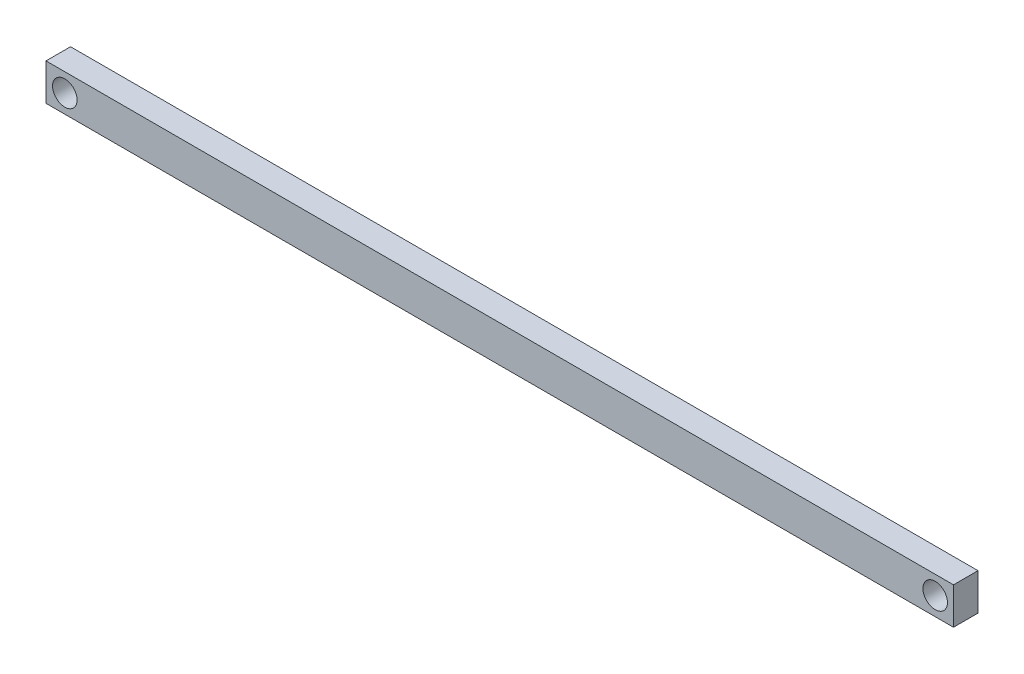
ISO-10303-21;
HEADER;
FILE_DESCRIPTION(('STEP AP214'),'2;1');
FILE_NAME('part.step','',(''),(''),'','','');
FILE_SCHEMA(('AUTOMOTIVE_DESIGN { 1 0 10303 214 1 1 1 1 }'));
ENDSEC;
DATA;
#1=APPLICATION_CONTEXT('core data for automotive mechanical design processes');
#2=APPLICATION_PROTOCOL_DEFINITION('international standard','automotive_design',2000,#1);
#3=PRODUCT_CONTEXT('',#1,'mechanical');
#4=PRODUCT('Part','Part','',(#3));
#5=PRODUCT_RELATED_PRODUCT_CATEGORY('part','',(#4));
#6=PRODUCT_DEFINITION_FORMATION('','',#4);
#7=PRODUCT_DEFINITION_CONTEXT('part definition',#1,'design');
#8=PRODUCT_DEFINITION('design','',#6,#7);
#9=PRODUCT_DEFINITION_SHAPE('','',#8);
#10=(LENGTH_UNIT() NAMED_UNIT(*) SI_UNIT(.MILLI.,.METRE.));
#11=(NAMED_UNIT(*) PLANE_ANGLE_UNIT() SI_UNIT($,.RADIAN.));
#12=(NAMED_UNIT(*) SI_UNIT($,.STERADIAN.) SOLID_ANGLE_UNIT());
#13=UNCERTAINTY_MEASURE_WITH_UNIT(LENGTH_MEASURE(1.E-05),#10,'distance_accuracy_value','');
#14=(GEOMETRIC_REPRESENTATION_CONTEXT(3) GLOBAL_UNCERTAINTY_ASSIGNED_CONTEXT((#13)) GLOBAL_UNIT_ASSIGNED_CONTEXT((#10,
#11,#12)) REPRESENTATION_CONTEXT('',''));
#15=CARTESIAN_POINT('',(0.,0.,0.));
#16=DIRECTION('',(0.,0.,1.));
#17=DIRECTION('',(1.,0.,0.));
#18=AXIS2_PLACEMENT_3D('',#15,#16,#17);
#19=CARTESIAN_POINT('',(0.,0.,10.));
#20=DIRECTION('',(0.,0.,1.));
#21=DIRECTION('',(1.,0.,0.));
#22=AXIS2_PLACEMENT_3D('',#19,#20,#21);
#23=PLANE('',#22);
#24=CARTESIAN_POINT('',(-44.8667304709833,-1.49080396597525,10.));
#25=DIRECTION('',(0.,0.,1.));
#26=DIRECTION('',(1.,0.,0.));
#27=AXIS2_PLACEMENT_3D('',#24,#25,#26);
#28=CIRCLE('',#27,5.);
#29=CARTESIAN_POINT('',(-39.8667304709833,-1.49080396597525,10.));
#30=VERTEX_POINT('',#29);
#31=EDGE_CURVE('E106',#30,#30,#28,.T.);
#32=ORIENTED_EDGE('',*,*,#31,.F.);
#33=EDGE_LOOP('',(#32));
#34=FACE_BOUND('',#33,.T.);
#35=DIRECTION('',(0.,-1.,0.));
#36=VECTOR('',#35,1.);
#37=CARTESIAN_POINT('',(-52.5481940535641,6.00919603402475,10.));
#38=LINE('',#37,#36);
#39=CARTESIAN_POINT('',(-52.5481940535641,6.00919603402475,10.));
#40=VERTEX_POINT('',#39);
#41=CARTESIAN_POINT('',(-52.5481940535641,-8.99080396597525,10.));
#42=VERTEX_POINT('',#41);
#43=EDGE_CURVE('E91',#40,#42,#38,.T.);
#44=ORIENTED_EDGE('',*,*,#43,.T.);
#45=DIRECTION('',(1.,0.,0.));
#46=VECTOR('',#45,1.);
#47=CARTESIAN_POINT('',(-52.5481940535641,-8.99080396597525,10.));
#48=LINE('',#47,#46);
#49=CARTESIAN_POINT('',(317.451805946436,-8.99080396597525,10.));
#50=VERTEX_POINT('',#49);
#51=EDGE_CURVE('E86',#42,#50,#48,.T.);
#52=ORIENTED_EDGE('',*,*,#51,.T.);
#53=DIRECTION('',(0.,1.,0.));
#54=VECTOR('',#53,1.);
#55=CARTESIAN_POINT('',(317.451805946436,6.00919603402475,10.));
#56=LINE('',#55,#54);
#57=CARTESIAN_POINT('',(317.451805946436,6.00919603402475,10.));
#58=VERTEX_POINT('',#57);
#59=EDGE_CURVE('E89',#50,#58,#56,.T.);
#60=ORIENTED_EDGE('',*,*,#59,.T.);
#61=DIRECTION('',(-1.,0.,0.));
#62=VECTOR('',#61,1.);
#63=CARTESIAN_POINT('',(-52.5481940535641,6.00919603402475,10.));
#64=LINE('',#63,#62);
#65=EDGE_CURVE('E56',#58,#40,#64,.T.);
#66=ORIENTED_EDGE('',*,*,#65,.T.);
#67=EDGE_LOOP('',(#44,#52,#60,#66));
#68=FACE_BOUND('',#67,.T.);
#69=CARTESIAN_POINT('',(309.994324271964,-1.49080396597525,10.));
#70=DIRECTION('',(0.,0.,1.));
#71=DIRECTION('',(1.,0.,0.));
#72=AXIS2_PLACEMENT_3D('',#69,#70,#71);
#73=CIRCLE('',#72,4.99999999999999);
#74=CARTESIAN_POINT('',(314.994324271964,-1.49080396597525,10.));
#75=VERTEX_POINT('',#74);
#76=EDGE_CURVE('E121',#75,#75,#73,.T.);
#77=ORIENTED_EDGE('',*,*,#76,.F.);
#78=EDGE_LOOP('',(#77));
#79=FACE_BOUND('',#78,.T.);
#80=ADVANCED_FACE('F39',(#34,#68,#79),#23,.T.);
#81=CARTESIAN_POINT('',(0.,0.,0.));
#82=DIRECTION('',(0.,0.,1.));
#83=DIRECTION('',(1.,0.,0.));
#84=AXIS2_PLACEMENT_3D('',#81,#82,#83);
#85=PLANE('',#84);
#86=DIRECTION('',(0.,-1.,0.));
#87=VECTOR('',#86,1.);
#88=CARTESIAN_POINT('',(-52.5481940535641,6.00919603402475,0.));
#89=LINE('',#88,#87);
#90=CARTESIAN_POINT('',(-52.5481940535641,6.00919603402475,0.));
#91=VERTEX_POINT('',#90);
#92=CARTESIAN_POINT('',(-52.5481940535641,-8.99080396597525,0.));
#93=VERTEX_POINT('',#92);
#94=EDGE_CURVE('E103',#91,#93,#89,.T.);
#95=ORIENTED_EDGE('',*,*,#94,.F.);
#96=DIRECTION('',(-1.,0.,0.));
#97=VECTOR('',#96,1.);
#98=CARTESIAN_POINT('',(-52.5481940535641,6.00919603402475,0.));
#99=LINE('',#98,#97);
#100=CARTESIAN_POINT('',(317.451805946436,6.00919603402475,0.));
#101=VERTEX_POINT('',#100);
#102=EDGE_CURVE('E79',#101,#91,#99,.T.);
#103=ORIENTED_EDGE('',*,*,#102,.F.);
#104=DIRECTION('',(0.,1.,0.));
#105=VECTOR('',#104,1.);
#106=CARTESIAN_POINT('',(317.451805946436,6.00919603402475,0.));
#107=LINE('',#106,#105);
#108=CARTESIAN_POINT('',(317.451805946436,-8.99080396597525,0.));
#109=VERTEX_POINT('',#108);
#110=EDGE_CURVE('E73',#109,#101,#107,.T.);
#111=ORIENTED_EDGE('',*,*,#110,.F.);
#112=DIRECTION('',(1.,0.,0.));
#113=VECTOR('',#112,1.);
#114=CARTESIAN_POINT('',(-52.5481940535641,-8.99080396597525,0.));
#115=LINE('',#114,#113);
#116=EDGE_CURVE('E95',#93,#109,#115,.T.);
#117=ORIENTED_EDGE('',*,*,#116,.F.);
#118=EDGE_LOOP('',(#95,#103,#111,#117));
#119=FACE_BOUND('',#118,.T.);
#120=CARTESIAN_POINT('',(-44.8667304709833,-1.49080396597525,0.));
#121=DIRECTION('',(0.,0.,1.));
#122=DIRECTION('',(1.,0.,0.));
#123=AXIS2_PLACEMENT_3D('',#120,#121,#122);
#124=CIRCLE('',#123,5.);
#125=CARTESIAN_POINT('',(-39.8667304709833,-1.49080396597525,0.));
#126=VERTEX_POINT('',#125);
#127=EDGE_CURVE('E118',#126,#126,#124,.T.);
#128=ORIENTED_EDGE('',*,*,#127,.T.);
#129=EDGE_LOOP('',(#128));
#130=FACE_BOUND('',#129,.T.);
#131=CARTESIAN_POINT('',(309.994324271964,-1.49080396597525,0.));
#132=DIRECTION('',(0.,0.,1.));
#133=DIRECTION('',(1.,0.,0.));
#134=AXIS2_PLACEMENT_3D('',#131,#132,#133);
#135=CIRCLE('',#134,4.99999999999999);
#136=CARTESIAN_POINT('',(314.994324271964,-1.49080396597525,0.));
#137=VERTEX_POINT('',#136);
#138=EDGE_CURVE('E124',#137,#137,#135,.T.);
#139=ORIENTED_EDGE('',*,*,#138,.T.);
#140=EDGE_LOOP('',(#139));
#141=FACE_BOUND('',#140,.T.);
#142=ADVANCED_FACE('F114',(#119,#130,#141),#85,.F.);
#143=CARTESIAN_POINT('',(-52.5481940535641,6.00919603402475,10.));
#144=DIRECTION('',(1.,0.,0.));
#145=DIRECTION('',(0.,0.,-1.));
#146=AXIS2_PLACEMENT_3D('',#143,#144,#145);
#147=PLANE('',#146);
#148=ORIENTED_EDGE('',*,*,#94,.T.);
#149=DIRECTION('',(0.,0.,-1.));
#150=VECTOR('',#149,1.);
#151=CARTESIAN_POINT('',(-52.5481940535641,-8.99080396597525,10.));
#152=LINE('',#151,#150);
#153=EDGE_CURVE('E11',#42,#93,#152,.T.);
#154=ORIENTED_EDGE('',*,*,#153,.F.);
#155=ORIENTED_EDGE('',*,*,#43,.F.);
#156=DIRECTION('',(0.,0.,-1.));
#157=VECTOR('',#156,1.);
#158=CARTESIAN_POINT('',(-52.5481940535641,6.00919603402475,10.));
#159=LINE('',#158,#157);
#160=EDGE_CURVE('E99',#40,#91,#159,.T.);
#161=ORIENTED_EDGE('',*,*,#160,.T.);
#162=EDGE_LOOP('',(#148,#154,#155,#161));
#163=FACE_BOUND('',#162,.T.);
#164=ADVANCED_FACE('F41',(#163),#147,.F.);
#165=CARTESIAN_POINT('',(-52.5481940535641,-8.99080396597525,10.));
#166=DIRECTION('',(0.,1.,0.));
#167=DIRECTION('',(0.,0.,1.));
#168=AXIS2_PLACEMENT_3D('',#165,#166,#167);
#169=PLANE('',#168);
#170=ORIENTED_EDGE('',*,*,#116,.T.);
#171=DIRECTION('',(0.,0.,-1.));
#172=VECTOR('',#171,1.);
#173=CARTESIAN_POINT('',(317.451805946436,-8.99080396597525,10.));
#174=LINE('',#173,#172);
#175=EDGE_CURVE('E48',#50,#109,#174,.T.);
#176=ORIENTED_EDGE('',*,*,#175,.F.);
#177=ORIENTED_EDGE('',*,*,#51,.F.);
#178=ORIENTED_EDGE('',*,*,#153,.T.);
#179=EDGE_LOOP('',(#170,#176,#177,#178));
#180=FACE_BOUND('',#179,.T.);
#181=ADVANCED_FACE('F94',(#180),#169,.F.);
#182=CARTESIAN_POINT('',(317.451805946436,6.00919603402475,10.));
#183=DIRECTION('',(-1.,0.,0.));
#184=DIRECTION('',(0.,0.,1.));
#185=AXIS2_PLACEMENT_3D('',#182,#183,#184);
#186=PLANE('',#185);
#187=ORIENTED_EDGE('',*,*,#110,.T.);
#188=DIRECTION('',(0.,0.,-1.));
#189=VECTOR('',#188,1.);
#190=CARTESIAN_POINT('',(317.451805946436,6.00919603402475,10.));
#191=LINE('',#190,#189);
#192=EDGE_CURVE('E96',#58,#101,#191,.T.);
#193=ORIENTED_EDGE('',*,*,#192,.F.);
#194=ORIENTED_EDGE('',*,*,#59,.F.);
#195=ORIENTED_EDGE('',*,*,#175,.T.);
#196=EDGE_LOOP('',(#187,#193,#194,#195));
#197=FACE_BOUND('',#196,.T.);
#198=ADVANCED_FACE('F97',(#197),#186,.F.);
#199=CARTESIAN_POINT('',(-52.5481940535641,6.00919603402475,10.));
#200=DIRECTION('',(0.,-1.,0.));
#201=DIRECTION('',(0.,0.,-1.));
#202=AXIS2_PLACEMENT_3D('',#199,#200,#201);
#203=PLANE('',#202);
#204=ORIENTED_EDGE('',*,*,#102,.T.);
#205=ORIENTED_EDGE('',*,*,#160,.F.);
#206=ORIENTED_EDGE('',*,*,#65,.F.);
#207=ORIENTED_EDGE('',*,*,#192,.T.);
#208=EDGE_LOOP('',(#204,#205,#206,#207));
#209=FACE_BOUND('',#208,.T.);
#210=ADVANCED_FACE('F111',(#209),#203,.F.);
#211=CARTESIAN_POINT('',(-44.8667304709833,-1.49080396597525,10.));
#212=DIRECTION('',(0.,0.,-1.));
#213=DIRECTION('',(-1.,0.,0.));
#214=AXIS2_PLACEMENT_3D('',#211,#212,#213);
#215=CYLINDRICAL_SURFACE('',#214,5.);
#216=ORIENTED_EDGE('',*,*,#31,.T.);
#217=EDGE_LOOP('',(#216));
#218=FACE_BOUND('',#217,.T.);
#219=ORIENTED_EDGE('',*,*,#127,.F.);
#220=EDGE_LOOP('',(#219));
#221=FACE_BOUND('',#220,.T.);
#222=ADVANCED_FACE('F141',(#218,#221),#215,.F.);
#223=CARTESIAN_POINT('',(309.994324271964,-1.49080396597525,10.));
#224=DIRECTION('',(0.,0.,-1.));
#225=DIRECTION('',(-1.,0.,0.));
#226=AXIS2_PLACEMENT_3D('',#223,#224,#225);
#227=CYLINDRICAL_SURFACE('',#226,4.99999999999999);
#228=ORIENTED_EDGE('',*,*,#76,.T.);
#229=EDGE_LOOP('',(#228));
#230=FACE_BOUND('',#229,.T.);
#231=ORIENTED_EDGE('',*,*,#138,.F.);
#232=EDGE_LOOP('',(#231));
#233=FACE_BOUND('',#232,.T.);
#234=ADVANCED_FACE('F130',(#230,#233),#227,.F.);
#235=CLOSED_SHELL('',(#80,#142,#164,#181,#198,#210,#222,#234));
#236=MANIFOLD_SOLID_BREP('B2',#235);
#237=ADVANCED_BREP_SHAPE_REPRESENTATION('',(#18,#236),#14);
#238=SHAPE_DEFINITION_REPRESENTATION(#9,#237);
ENDSEC;
END-ISO-10303-21;
